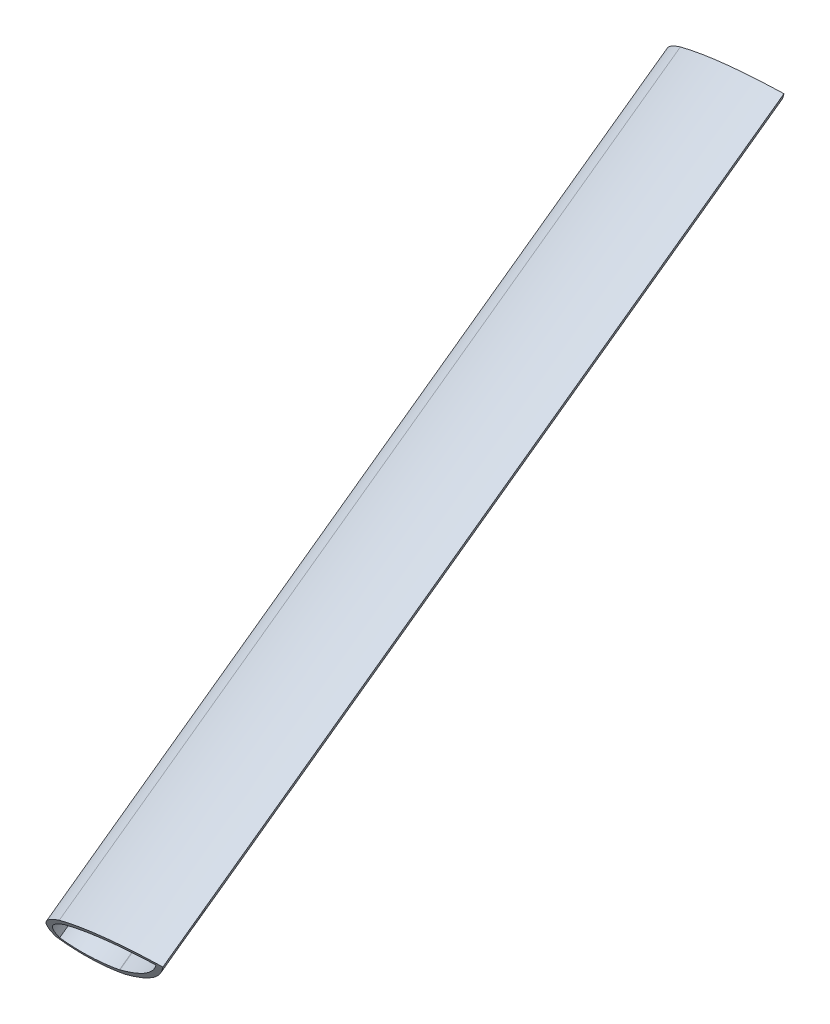
ISO-10303-21;
HEADER;
FILE_DESCRIPTION(('STEP AP214'),'2;1');
FILE_NAME('part.step','',(''),(''),'','','');
FILE_SCHEMA(('AUTOMOTIVE_DESIGN { 1 0 10303 214 1 1 1 1 }'));
ENDSEC;
DATA;
#1=APPLICATION_CONTEXT('core data for automotive mechanical design processes');
#2=APPLICATION_PROTOCOL_DEFINITION('international standard','automotive_design',2000,#1);
#3=PRODUCT_CONTEXT('',#1,'mechanical');
#4=PRODUCT('Part','Part','',(#3));
#5=PRODUCT_RELATED_PRODUCT_CATEGORY('part','',(#4));
#6=PRODUCT_DEFINITION_FORMATION('','',#4);
#7=PRODUCT_DEFINITION_CONTEXT('part definition',#1,'design');
#8=PRODUCT_DEFINITION('design','',#6,#7);
#9=PRODUCT_DEFINITION_SHAPE('','',#8);
#10=(LENGTH_UNIT() NAMED_UNIT(*) SI_UNIT(.MILLI.,.METRE.));
#11=(NAMED_UNIT(*) PLANE_ANGLE_UNIT() SI_UNIT($,.RADIAN.));
#12=(NAMED_UNIT(*) SI_UNIT($,.STERADIAN.) SOLID_ANGLE_UNIT());
#13=UNCERTAINTY_MEASURE_WITH_UNIT(LENGTH_MEASURE(1.E-05),#10,'distance_accuracy_value','');
#14=(GEOMETRIC_REPRESENTATION_CONTEXT(3) GLOBAL_UNCERTAINTY_ASSIGNED_CONTEXT((#13)) GLOBAL_UNIT_ASSIGNED_CONTEXT((#10,
#11,#12)) REPRESENTATION_CONTEXT('',''));
#15=CARTESIAN_POINT('',(0.,0.,0.));
#16=DIRECTION('',(0.,0.,1.));
#17=DIRECTION('',(1.,0.,0.));
#18=AXIS2_PLACEMENT_3D('',#15,#16,#17);
#19=CARTESIAN_POINT('',(-781.107520332874,334.657765301995,434.052857789617));
#20=DIRECTION('',(-0.0147326927785277,0.5661762234603,-0.824152553688773));
#21=DIRECTION('',(0.,0.824242010329109,0.566237678372455));
#22=AXIS2_PLACEMENT_3D('',#19,#20,#21);
#23=PLANE('',#22);
#24=DIRECTION('',(0.859046075895402,0.428966173917692,0.279334675833717));
#25=VECTOR('',#24,1.);
#26=CARTESIAN_POINT('',(-792.760380509847,326.928017950732,428.950985404653));
#27=LINE('',#26,#25);
#28=CARTESIAN_POINT('',(-792.796593426126,326.909934967085,428.939210107014));
#29=VERTEX_POINT('',#28);
#30=CARTESIAN_POINT('',(-792.611878379782,327.002172751435,428.999273611219));
#31=VERTEX_POINT('',#30);
#32=EDGE_CURVE('E304',#29,#31,#27,.T.);
#33=ORIENTED_EDGE('',*,*,#32,.T.);
#34=CARTESIAN_POINT('',(-792.611878379782,327.002172751435,428.999273611219));
#35=CARTESIAN_POINT('',(-790.503535609516,328.067935974323,429.693742405582));
#36=CARTESIAN_POINT('',(-788.481905018776,329.239479765861,430.462430404267));
#37=CARTESIAN_POINT('',(-785.59391722943,331.159438861091,431.729777509135));
#38=CARTESIAN_POINT('',(-784.658455705619,331.824324126815,432.169817838953));
#39=CARTESIAN_POINT('',(-782.841938872382,333.203896184277,433.085083719861));
#40=CARTESIAN_POINT('',(-781.959835350437,333.919509037805,433.560926718742));
#41=CARTESIAN_POINT('',(-779.402890297746,336.134277830375,435.036719931367));
#42=CARTESIAN_POINT('',(-777.820192779682,337.698664166072,436.083129297477));
#43=CARTESIAN_POINT('',(-775.625962113709,340.164138553547,437.73763615467));
#44=CARTESIAN_POINT('',(-774.926685937,341.00325719475,438.301593397965));
#45=CARTESIAN_POINT('',(-773.923763044823,342.286686714735,439.165355235097));
#46=CARTESIAN_POINT('',(-773.599626393743,342.719970355112,439.457218056392));
#47=CARTESIAN_POINT('',(-772.951459932842,343.586595135511,440.040985109994));
#48=CARTESIAN_POINT('',(-772.627376702391,344.01990752571,440.332868636795));
#49=CARTESIAN_POINT('',(-772.30329347194,344.453219915909,440.624752163596));
#50=B_SPLINE_CURVE_WITH_KNOTS('',3,(#34,#35,#36,#37,#38,#39,#40,#41,#42,#43,#44,#45,#46,#47,#48,
#49),.UNSPECIFIED.,.F.,.F.,(4,2,2,2,2,2,2,4),(0.,0.25000000000001,0.375000000000016,
0.500000000000021,0.750000000000023,0.875000000000016,0.937500000000008,1.),.UNSPECIFIED.);
#51=CARTESIAN_POINT('',(-772.30329347194,344.45321991591,440.624752163596));
#52=VERTEX_POINT('',#51);
#53=EDGE_CURVE('E336',#31,#52,#50,.T.);
#54=ORIENTED_EDGE('',*,*,#53,.T.);
#55=CARTESIAN_POINT('',(-800.427804121367,337.719246172713,436.501406270107));
#56=CARTESIAN_POINT('',(-798.304142877236,338.766730998508,437.183044337733));
#57=CARTESIAN_POINT('',(-796.108822244321,339.702450323204,437.786620759129));
#58=CARTESIAN_POINT('',(-792.709089325896,340.92293817373,438.564297147445));
#59=CARTESIAN_POINT('',(-791.561963398083,341.298161137011,438.801561553844));
#60=CARTESIAN_POINT('',(-789.239944105029,341.985384873826,439.232161618751));
#61=CARTESIAN_POINT('',(-788.063558818775,342.297724113374,439.425703126765));
#62=CARTESIAN_POINT('',(-784.503741280272,343.137349510131,439.938872971622));
#63=CARTESIAN_POINT('',(-782.093652371408,343.566510841312,440.190615008156));
#64=CARTESIAN_POINT('',(-778.435686076648,344.022646747793,440.438580764479));
#65=CARTESIAN_POINT('',(-777.212925884674,344.143017590887,440.499414840505));
#66=CARTESIAN_POINT('',(-775.373864976113,344.278241177467,440.559435354892));
#67=CARTESIAN_POINT('',(-774.759756507807,344.313290659061,440.572535735008));
#68=CARTESIAN_POINT('',(-773.531524989874,344.383255287485,440.598643949302));
#69=CARTESIAN_POINT('',(-772.917409230907,344.418237601697,440.611698056449));
#70=CARTESIAN_POINT('',(-772.30329347194,344.453219915909,440.624752163596));
#71=B_SPLINE_CURVE_WITH_KNOTS('',3,(#55,#56,#57,#58,#59,#60,#61,#62,#63,#64,#65,#66,#67,#68,#69,
#70),.UNSPECIFIED.,.F.,.F.,(4,2,2,2,2,2,2,4),(0.,0.250000000000015,0.375000000000015,
0.500000000000016,0.750000000000002,0.874999999999995,0.937499999999998,1.),.UNSPECIFIED.);
#72=CARTESIAN_POINT('',(-800.427804121367,337.719246172713,436.501406270107));
#73=VERTEX_POINT('',#72);
#74=EDGE_CURVE('E322',#73,#52,#71,.T.);
#75=ORIENTED_EDGE('',*,*,#74,.F.);
#76=CARTESIAN_POINT('',(-800.427804121367,337.719246172713,436.501406270107));
#77=CARTESIAN_POINT('',(-801.018629788744,337.397762318661,436.291115031462));
#78=CARTESIAN_POINT('',(-801.587069863766,337.053349134961,436.064671635961));
#79=CARTESIAN_POINT('',(-802.687987108001,336.327686336815,435.585836079048));
#80=CARTESIAN_POINT('',(-803.220864056987,335.946846212636,435.333732375745));
#81=CARTESIAN_POINT('',(-804.2533155772,335.151054684773,434.805495887364));
#82=CARTESIAN_POINT('',(-804.751573980345,334.737481325836,434.530286263255));
#83=CARTESIAN_POINT('',(-805.692284079329,333.880411667631,433.958312946746));
#84=CARTESIAN_POINT('',(-806.13596727307,333.435688767259,433.660728618533));
#85=CARTESIAN_POINT('',(-806.95342654856,332.503813923641,433.035162391716));
#86=CARTESIAN_POINT('',(-807.327371486566,332.016764465094,432.707253916542));
#87=CARTESIAN_POINT('',(-807.817606139182,331.243290470213,432.184656362349));
#88=CARTESIAN_POINT('',(-807.969929572516,330.976667045183,432.004214393374));
#89=CARTESIAN_POINT('',(-808.242492080457,330.434488574104,431.636621065963));
#90=CARTESIAN_POINT('',(-808.362285545601,330.160209671094,431.450338426329));
#91=CARTESIAN_POINT('',(-808.668942495774,329.327173276709,430.883541035419));
#92=CARTESIAN_POINT('',(-808.803297179031,328.758257624124,430.495109175391));
#93=CARTESIAN_POINT('',(-808.883829754309,327.881476033196,429.894217476343));
#94=CARTESIAN_POINT('',(-808.890091895998,327.586512964427,429.691695725511));
#95=CARTESIAN_POINT('',(-808.861147905313,327.001315792742,429.289159634247));
#96=CARTESIAN_POINT('',(-808.822122927993,326.709808966247,429.088202691994));
#97=CARTESIAN_POINT('',(-808.78905551815,326.418037233844,428.887170263213));
#98=B_SPLINE_CURVE_WITH_KNOTS('',3,(#76,#77,#78,#79,#80,#81,#82,#83,#84,#85,#86,#87,#88,#89,#90,
#91,#92,#93,#94,#95,#96,#97),.UNSPECIFIED.,.F.,.F.,(4,2,2,2,2,2,2,2,2,2,4),(0.,
0.124999999999991,0.249999999999981,0.374999999999972,0.499999999999962,0.624999999999953,
0.687499999999952,0.749999999999951,0.874999999999975,0.937499999999987,1.),.UNSPECIFIED.);
#99=CARTESIAN_POINT('',(-808.78905551815,326.418037233844,428.887170263213));
#100=VERTEX_POINT('',#99);
#101=EDGE_CURVE('E260',#73,#100,#98,.T.);
#102=ORIENTED_EDGE('',*,*,#101,.T.);
#103=CARTESIAN_POINT('',(-792.796593426126,326.909934967085,428.939210107014));
#104=CARTESIAN_POINT('',(-793.425045423054,326.640984541955,428.765680891869));
#105=CARTESIAN_POINT('',(-794.066302736607,326.398818081671,428.610780631755));
#106=CARTESIAN_POINT('',(-795.370285669853,325.959388881468,428.332211835144));
#107=CARTESIAN_POINT('',(-796.032601027481,325.761268025738,428.207946456433));
#108=CARTESIAN_POINT('',(-797.376763654905,325.405879817874,427.987830389881));
#109=CARTESIAN_POINT('',(-798.056475393877,325.248893328301,427.892134473853));
#110=CARTESIAN_POINT('',(-799.419962650095,324.989919108456,427.738598327728));
#111=CARTESIAN_POINT('',(-800.105625724563,324.887654150516,427.680601390099));
#112=CARTESIAN_POINT('',(-801.4872274321,324.754492175973,427.613819542358));
#113=CARTESIAN_POINT('',(-802.183141184108,324.723422350268,427.604915471091));
#114=CARTESIAN_POINT('',(-803.23740441286,324.748998458409,427.641331933602));
#115=CARTESIAN_POINT('',(-803.592621706374,324.7698618883,427.662014615617));
#116=CARTESIAN_POINT('',(-804.296784577416,324.839191823425,427.722230622792));
#117=CARTESIAN_POINT('',(-804.644113414739,324.887349652695,427.761522992651));
#118=CARTESIAN_POINT('',(-805.670901082643,325.074973411667,427.908771773235));
#119=CARTESIAN_POINT('',(-806.335223076776,325.257413569852,428.045980025649));
#120=CARTESIAN_POINT('',(-807.296818636635,325.63012095285,428.319212146953));
#121=CARTESIAN_POINT('',(-807.61007203493,325.7705768458,428.421302291229));
#122=CARTESIAN_POINT('',(-808.211196596432,326.079160776278,428.644039049179));
#123=CARTESIAN_POINT('',(-808.498522903462,326.250686357106,428.767009966802));
#124=CARTESIAN_POINT('',(-808.78905551815,326.418037233844,428.887170263213));
#125=B_SPLINE_CURVE_WITH_KNOTS('',3,(#103,#104,#105,#106,#107,#108,#109,#110,#111,#112,#113,
#114,#115,#116,#117,#118,#119,#120,#121,#122,#123,#124),.UNSPECIFIED.,.F.,.F.,(4,2,2,2,2,2,2,2,
2,2,4),(0.,0.125000000000006,0.250000000000013,0.375000000000019,0.500000000000025,
0.625000000000032,0.687500000000025,0.750000000000018,0.875000000000005,0.937500000000002,1.),.UNSPECIFIED.);
#126=EDGE_CURVE('E252',#29,#100,#125,.T.);
#127=ORIENTED_EDGE('',*,*,#126,.F.);
#128=EDGE_LOOP('',(#33,#54,#75,#102,#127));
#129=FACE_BOUND('',#128,.T.);
#130=DIRECTION('',(0.859046075895409,0.428966173917411,0.279334675834127));
#131=VECTOR('',#130,1.);
#132=CARTESIAN_POINT('',(-793.410222008644,327.821932425567,429.576703342803));
#133=LINE('',#132,#131);
#134=CARTESIAN_POINT('',(-793.410222008644,327.821932425567,429.576703342803));
#135=VERTEX_POINT('',#134);
#136=CARTESIAN_POINT('',(-793.261719878579,327.89608722627,429.624991549369));
#137=VERTEX_POINT('',#136);
#138=EDGE_CURVE('E189',#135,#137,#133,.T.);
#139=ORIENTED_EDGE('',*,*,#138,.F.);
#140=CARTESIAN_POINT('',(-793.410222008644,327.821932425567,429.576703342803));
#141=CARTESIAN_POINT('',(-794.68692202602,327.275559728663,429.224178801432));
#142=CARTESIAN_POINT('',(-799.829869031873,325.612926645429,428.173919528464));
#143=CARTESIAN_POINT('',(-804.812953252484,325.410870091522,428.12418921152));
#144=CARTESIAN_POINT('',(-807.578887011925,327.004086881108,429.268141399964));
#145=B_SPLINE_CURVE_WITH_KNOTS('',3,(#140,#141,#142,#143,#144),.UNSPECIFIED.,.F.,.F.,(4,1,4),
(0.,0.294150135644974,1.),.UNSPECIFIED.);
#146=CARTESIAN_POINT('',(-807.578887011925,327.004086881107,429.268141399964));
#147=VERTEX_POINT('',#146);
#148=EDGE_CURVE('E370',#135,#147,#145,.T.);
#149=ORIENTED_EDGE('',*,*,#148,.T.);
#150=CARTESIAN_POINT('',(-799.759532830395,336.834403820628,435.881591243632));
#151=CARTESIAN_POINT('',(-800.960700162994,336.180816942523,435.454062481531));
#152=CARTESIAN_POINT('',(-805.233822764462,333.28351953377,433.540064526205));
#153=CARTESIAN_POINT('',(-807.893964040924,329.784182782966,431.183643723624));
#154=CARTESIAN_POINT('',(-807.578887011925,327.004086881107,429.268141399964));
#155=B_SPLINE_CURVE_WITH_KNOTS('',3,(#150,#151,#152,#153,#154),.UNSPECIFIED.,.F.,.F.,(4,1,4),
(0.,0.294150135644974,1.),.UNSPECIFIED.);
#156=CARTESIAN_POINT('',(-799.759532830395,336.834403820628,435.881591243632));
#157=VERTEX_POINT('',#156);
#158=EDGE_CURVE('E217',#157,#147,#155,.T.);
#159=ORIENTED_EDGE('',*,*,#158,.F.);
#160=CARTESIAN_POINT('',(-799.759532830395,336.834403820628,435.881591243632));
#161=CARTESIAN_POINT('',(-788.284819564579,342.49424625525,439.564665179595));
#162=CARTESIAN_POINT('',(-774.67362554331,343.269590413256,439.853994972157));
#163=B_SPLINE_CURVE_WITH_KNOTS('',2,(#160,#161,#162),.UNSPECIFIED.,.F.,.F.,(3,3),(0.,1.),.UNSPECIFIED.);
#164=CARTESIAN_POINT('',(-774.67362554331,343.269590413256,439.853994972157));
#165=VERTEX_POINT('',#164);
#166=EDGE_CURVE('E213',#157,#165,#163,.T.);
#167=ORIENTED_EDGE('',*,*,#166,.T.);
#168=CARTESIAN_POINT('',(-793.261719878579,327.89608722627,429.624991549369));
#169=CARTESIAN_POINT('',(-781.861756604429,333.658754887763,433.380040591182));
#170=CARTESIAN_POINT('',(-774.67362554331,343.269590413256,439.853994972157));
#171=B_SPLINE_CURVE_WITH_KNOTS('',2,(#168,#169,#170),.UNSPECIFIED.,.F.,.F.,(3,3),(0.,1.),.UNSPECIFIED.);
#172=EDGE_CURVE('E198',#137,#165,#171,.T.);
#173=ORIENTED_EDGE('',*,*,#172,.F.);
#174=EDGE_LOOP('',(#139,#149,#159,#167,#173));
#175=FACE_BOUND('',#174,.T.);
#176=ADVANCED_FACE('F111',(#129,#175),#23,.F.);
#177=CARTESIAN_POINT('',(-783.726993108882,435.323897833222,287.518533743743));
#178=DIRECTION('',(-0.0147326927785277,0.5661762234603,-0.824152553688773));
#179=DIRECTION('',(0.,0.824242010329109,0.566237678372455));
#180=AXIS2_PLACEMENT_3D('',#177,#178,#179);
#181=PLANE('',#180);
#182=DIRECTION('',(0.859046075895402,0.428966173917692,0.279334675833717));
#183=VECTOR('',#182,1.);
#184=CARTESIAN_POINT('',(-795.379853285855,427.59415048196,282.41666135878));
#185=LINE('',#184,#183);
#186=CARTESIAN_POINT('',(-795.416066202135,427.576067498312,282.40488606114));
#187=VERTEX_POINT('',#186);
#188=CARTESIAN_POINT('',(-795.23135115579,427.668305282663,282.464949565346));
#189=VERTEX_POINT('',#188);
#190=EDGE_CURVE('E207',#187,#189,#185,.T.);
#191=ORIENTED_EDGE('',*,*,#190,.F.);
#192=CARTESIAN_POINT('',(-795.416066202135,427.576067498312,282.40488606114));
#193=CARTESIAN_POINT('',(-796.044518199063,427.307117073183,282.231356845995));
#194=CARTESIAN_POINT('',(-796.685775512616,427.064950612898,282.076456585881));
#195=CARTESIAN_POINT('',(-797.989758445861,426.625521412696,281.79788778927));
#196=CARTESIAN_POINT('',(-798.65207380349,426.427400556965,281.673622410559));
#197=CARTESIAN_POINT('',(-799.996236430913,426.072012349101,281.453506344007));
#198=CARTESIAN_POINT('',(-800.675948169885,425.915025859529,281.357810427979));
#199=CARTESIAN_POINT('',(-802.039435426103,425.656051639684,281.204274281854));
#200=CARTESIAN_POINT('',(-802.725098500572,425.553786681744,281.146277344225));
#201=CARTESIAN_POINT('',(-804.106700208109,425.420624707201,281.079495496484));
#202=CARTESIAN_POINT('',(-804.802613960117,425.389554881496,281.070591425218));
#203=CARTESIAN_POINT('',(-805.856877188869,425.415130989636,281.107007887728));
#204=CARTESIAN_POINT('',(-806.212094482382,425.435994419528,281.127690569743));
#205=CARTESIAN_POINT('',(-806.916257353425,425.505324354653,281.187906576919));
#206=CARTESIAN_POINT('',(-807.263586190747,425.553482183922,281.227198946777));
#207=CARTESIAN_POINT('',(-808.290373858651,425.741105942895,281.374447727362));
#208=CARTESIAN_POINT('',(-808.954695852784,425.92354610108,281.511655979776));
#209=CARTESIAN_POINT('',(-809.916291412643,426.296253484078,281.784888101079));
#210=CARTESIAN_POINT('',(-810.229544810939,426.436709377027,281.886978245355));
#211=CARTESIAN_POINT('',(-810.830669372441,426.745293307505,282.109715003305));
#212=CARTESIAN_POINT('',(-811.11799567947,426.916818888334,282.232685920929));
#213=CARTESIAN_POINT('',(-811.408528294158,427.084169765072,282.352846217339));
#214=B_SPLINE_CURVE_WITH_KNOTS('',3,(#192,#193,#194,#195,#196,#197,#198,#199,#200,#201,#202,
#203,#204,#205,#206,#207,#208,#209,#210,#211,#212,#213),.UNSPECIFIED.,.F.,.F.,(4,2,2,2,2,2,2,2,
2,2,4),(0.,0.125000000000006,0.250000000000013,0.375000000000019,0.500000000000025,
0.625000000000032,0.687500000000025,0.750000000000018,0.875000000000005,0.937500000000002,1.),.UNSPECIFIED.);
#215=CARTESIAN_POINT('',(-811.408528294158,427.084169765072,282.352846217339));
#216=VERTEX_POINT('',#215);
#217=EDGE_CURVE('E295',#187,#216,#214,.T.);
#218=ORIENTED_EDGE('',*,*,#217,.T.);
#219=CARTESIAN_POINT('',(-803.047276897376,438.38537870394,289.967082224233));
#220=CARTESIAN_POINT('',(-803.638102564752,438.063894849889,289.756790985589));
#221=CARTESIAN_POINT('',(-804.206542639775,437.719481666189,289.530347590087));
#222=CARTESIAN_POINT('',(-805.307459884009,436.993818868042,289.051512033175));
#223=CARTESIAN_POINT('',(-805.840336832995,436.612978743863,288.799408329872));
#224=CARTESIAN_POINT('',(-806.872788353209,435.817187216,288.27117184149));
#225=CARTESIAN_POINT('',(-807.371046756353,435.403613857063,287.995962217382));
#226=CARTESIAN_POINT('',(-808.311756855337,434.546544198859,287.423988900873));
#227=CARTESIAN_POINT('',(-808.755440049078,434.101821298487,287.126404572659));
#228=CARTESIAN_POINT('',(-809.572899324568,433.169946454868,286.500838345842));
#229=CARTESIAN_POINT('',(-809.946844262574,432.682896996321,286.172929870668));
#230=CARTESIAN_POINT('',(-810.437078915191,431.90942300144,285.650332316475));
#231=CARTESIAN_POINT('',(-810.589402348524,431.64279957641,285.4698903475));
#232=CARTESIAN_POINT('',(-810.861964856465,431.100621105331,285.102297020089));
#233=CARTESIAN_POINT('',(-810.981758321609,430.826342202321,284.916014380456));
#234=CARTESIAN_POINT('',(-811.288415271782,429.993305807936,284.349216989546));
#235=CARTESIAN_POINT('',(-811.422769955039,429.424390155351,283.960785129518));
#236=CARTESIAN_POINT('',(-811.503302530317,428.547608564423,283.35989343047));
#237=CARTESIAN_POINT('',(-811.509564672007,428.252645495655,283.157371679637));
#238=CARTESIAN_POINT('',(-811.480620681322,427.66744832397,282.754835588374));
#239=CARTESIAN_POINT('',(-811.441595704002,427.375941497475,282.553878646121));
#240=CARTESIAN_POINT('',(-811.408528294158,427.084169765072,282.352846217339));
#241=B_SPLINE_CURVE_WITH_KNOTS('',3,(#219,#220,#221,#222,#223,#224,#225,#226,#227,#228,#229,
#230,#231,#232,#233,#234,#235,#236,#237,#238,#239,#240),.UNSPECIFIED.,.F.,.F.,(4,2,2,2,2,2,2,2,
2,2,4),(0.,0.124999999999991,0.249999999999981,0.374999999999972,0.499999999999962,
0.624999999999953,0.687499999999952,0.749999999999951,0.874999999999975,0.937499999999987,1.),.UNSPECIFIED.);
#242=CARTESIAN_POINT('',(-803.047276897376,438.38537870394,289.967082224233));
#243=VERTEX_POINT('',#242);
#244=EDGE_CURVE('E286',#243,#216,#241,.T.);
#245=ORIENTED_EDGE('',*,*,#244,.F.);
#246=CARTESIAN_POINT('',(-803.047276897376,438.38537870394,289.967082224233));
#247=CARTESIAN_POINT('',(-800.923615653245,439.432863529735,290.648720291859));
#248=CARTESIAN_POINT('',(-798.728295020329,440.368582854431,291.252296713255));
#249=CARTESIAN_POINT('',(-795.328562101904,441.589070704958,292.029973101571));
#250=CARTESIAN_POINT('',(-794.181436174091,441.964293668238,292.26723750797));
#251=CARTESIAN_POINT('',(-791.859416881038,442.651517405053,292.697837572878));
#252=CARTESIAN_POINT('',(-790.683031594783,442.963856644601,292.891379080891));
#253=CARTESIAN_POINT('',(-787.12321405628,443.803482041358,293.404548925748));
#254=CARTESIAN_POINT('',(-784.713125147416,444.23264337254,293.656290962283));
#255=CARTESIAN_POINT('',(-781.055158852656,444.68877927902,293.904256718606));
#256=CARTESIAN_POINT('',(-779.832398660682,444.809150122114,293.965090794631));
#257=CARTESIAN_POINT('',(-777.993337752121,444.944373708695,294.025111309019));
#258=CARTESIAN_POINT('',(-777.379229283816,444.979423190288,294.038211689135));
#259=CARTESIAN_POINT('',(-776.150997765882,445.049387818713,294.064319903428));
#260=CARTESIAN_POINT('',(-775.536882006915,445.084370132925,294.077374010575));
#261=CARTESIAN_POINT('',(-774.922766247948,445.119352447137,294.090428117722));
#262=B_SPLINE_CURVE_WITH_KNOTS('',3,(#246,#247,#248,#249,#250,#251,#252,#253,#254,#255,#256,
#257,#258,#259,#260,#261),.UNSPECIFIED.,.F.,.F.,(4,2,2,2,2,2,2,4),(0.,0.250000000000015,
0.375000000000015,0.500000000000016,0.750000000000002,0.874999999999995,0.937499999999998,1.),.UNSPECIFIED.);
#263=CARTESIAN_POINT('',(-774.922766247949,445.119352447137,294.090428117722));
#264=VERTEX_POINT('',#263);
#265=EDGE_CURVE('E277',#243,#264,#262,.T.);
#266=ORIENTED_EDGE('',*,*,#265,.T.);
#267=CARTESIAN_POINT('',(-795.23135115579,427.668305282663,282.464949565346));
#268=CARTESIAN_POINT('',(-793.123008385524,428.734068505551,283.159418359709));
#269=CARTESIAN_POINT('',(-791.101377794784,429.905612297088,283.928106358393));
#270=CARTESIAN_POINT('',(-788.213390005438,431.825571392318,285.195453463261));
#271=CARTESIAN_POINT('',(-787.277928481627,432.490456658042,285.635493793079));
#272=CARTESIAN_POINT('',(-785.461411648391,433.870028715504,286.550759673987));
#273=CARTESIAN_POINT('',(-784.579308126446,434.585641569033,287.026602672868));
#274=CARTESIAN_POINT('',(-782.022363073754,436.800410361603,288.502395885494));
#275=CARTESIAN_POINT('',(-780.43966555569,438.3647966973,289.548805251603));
#276=CARTESIAN_POINT('',(-778.245434889717,440.830271084774,291.203312108796));
#277=CARTESIAN_POINT('',(-777.546158713008,441.669389725977,291.767269352091));
#278=CARTESIAN_POINT('',(-776.543235820831,442.952819245962,292.631031189223));
#279=CARTESIAN_POINT('',(-776.219099169751,443.38610288634,292.922894010519));
#280=CARTESIAN_POINT('',(-775.57093270885,444.252727666738,293.50666106412));
#281=CARTESIAN_POINT('',(-775.2468494784,444.686040056938,293.798544590921));
#282=CARTESIAN_POINT('',(-774.922766247949,445.119352447137,294.090428117722));
#283=B_SPLINE_CURVE_WITH_KNOTS('',3,(#267,#268,#269,#270,#271,#272,#273,#274,#275,#276,#277,
#278,#279,#280,#281,#282),.UNSPECIFIED.,.F.,.F.,(4,2,2,2,2,2,2,4),(0.,0.25000000000001,
0.375000000000016,0.500000000000021,0.750000000000023,0.875000000000016,0.937500000000008,1.),.UNSPECIFIED.);
#284=EDGE_CURVE('E271',#189,#264,#283,.T.);
#285=ORIENTED_EDGE('',*,*,#284,.F.);
#286=EDGE_LOOP('',(#191,#218,#245,#266,#285));
#287=FACE_BOUND('',#286,.T.);
#288=CARTESIAN_POINT('',(-796.029694784653,428.488064956795,283.042379296929));
#289=CARTESIAN_POINT('',(-797.306394802028,427.94169225989,282.689854755558));
#290=CARTESIAN_POINT('',(-802.449341807882,426.279059176656,281.63959548259));
#291=CARTESIAN_POINT('',(-807.432426028492,426.077002622749,281.589865165646));
#292=CARTESIAN_POINT('',(-810.198359787934,427.670219412335,282.73381735409));
#293=B_SPLINE_CURVE_WITH_KNOTS('',3,(#288,#289,#290,#291,#292),.UNSPECIFIED.,.F.,.F.,(4,1,4),
(0.,0.294150135644974,1.),.UNSPECIFIED.);
#294=CARTESIAN_POINT('',(-796.029694784653,428.488064956794,283.042379296929));
#295=VERTEX_POINT('',#294);
#296=CARTESIAN_POINT('',(-810.198359787934,427.670219412335,282.73381735409));
#297=VERTEX_POINT('',#296);
#298=EDGE_CURVE('E199',#295,#297,#293,.T.);
#299=ORIENTED_EDGE('',*,*,#298,.F.);
#300=DIRECTION('',(0.859046075895409,0.428966173917411,0.279334675834127));
#301=VECTOR('',#300,1.);
#302=CARTESIAN_POINT('',(-796.029694784653,428.488064956795,283.042379296929));
#303=LINE('',#302,#301);
#304=CARTESIAN_POINT('',(-795.881192654587,428.562219757497,283.090667503495));
#305=VERTEX_POINT('',#304);
#306=EDGE_CURVE('E135',#295,#305,#303,.T.);
#307=ORIENTED_EDGE('',*,*,#306,.T.);
#308=CARTESIAN_POINT('',(-795.881192654587,428.562219757497,283.090667503495));
#309=CARTESIAN_POINT('',(-784.481229380437,434.324887418991,286.845716545308));
#310=CARTESIAN_POINT('',(-777.293098319318,443.935722944483,293.319670926284));
#311=B_SPLINE_CURVE_WITH_KNOTS('',2,(#308,#309,#310),.UNSPECIFIED.,.F.,.F.,(3,3),(0.,1.),.UNSPECIFIED.);
#312=CARTESIAN_POINT('',(-777.293098319318,443.935722944483,293.319670926284));
#313=VERTEX_POINT('',#312);
#314=EDGE_CURVE('E205',#305,#313,#311,.T.);
#315=ORIENTED_EDGE('',*,*,#314,.T.);
#316=CARTESIAN_POINT('',(-802.379005606403,437.500536351855,289.347267197759));
#317=CARTESIAN_POINT('',(-790.904292340587,443.160378786478,293.030341133722));
#318=CARTESIAN_POINT('',(-777.293098319318,443.935722944483,293.319670926284));
#319=B_SPLINE_CURVE_WITH_KNOTS('',2,(#316,#317,#318),.UNSPECIFIED.,.F.,.F.,(3,3),(0.,1.),.UNSPECIFIED.);
#320=CARTESIAN_POINT('',(-802.379005606403,437.500536351855,289.347267197759));
#321=VERTEX_POINT('',#320);
#322=EDGE_CURVE('E384',#321,#313,#319,.T.);
#323=ORIENTED_EDGE('',*,*,#322,.F.);
#324=CARTESIAN_POINT('',(-802.379005606403,437.500536351855,289.347267197759));
#325=CARTESIAN_POINT('',(-803.580172939002,436.846949473751,288.919738435657));
#326=CARTESIAN_POINT('',(-807.85329554047,433.949652064997,287.005740480331));
#327=CARTESIAN_POINT('',(-810.513436816932,430.450315314194,284.649319677751));
#328=CARTESIAN_POINT('',(-810.198359787934,427.670219412335,282.73381735409));
#329=B_SPLINE_CURVE_WITH_KNOTS('',3,(#324,#325,#326,#327,#328),.UNSPECIFIED.,.F.,.F.,(4,1,4),
(0.,0.294150135644974,1.),.UNSPECIFIED.);
#330=EDGE_CURVE('E375',#321,#297,#329,.T.);
#331=ORIENTED_EDGE('',*,*,#330,.T.);
#332=EDGE_LOOP('',(#299,#307,#315,#323,#331));
#333=FACE_BOUND('',#332,.T.);
#334=ADVANCED_FACE('F240',(#287,#333),#181,.T.);
#335=CARTESIAN_POINT('',(-792.760380509847,326.928017950732,428.950985404653));
#336=DIRECTION('',(-0.511686219525411,0.703869665224137,0.492691289881458));
#337=DIRECTION('',(-0.808855773889066,-0.588007089282365,0.));
#338=AXIS2_PLACEMENT_3D('',#335,#336,#337);
#339=PLANE('',#338);
#340=ORIENTED_EDGE('',*,*,#190,.T.);
#341=DIRECTION('',(-0.0147326927784492,0.566176223460222,-0.824152553688828));
#342=VECTOR('',#341,1.);
#343=CARTESIAN_POINT('',(-792.611878379782,327.002172751435,428.999273611219));
#344=LINE('',#343,#342);
#345=EDGE_CURVE('E12',#31,#189,#344,.T.);
#346=ORIENTED_EDGE('',*,*,#345,.F.);
#347=ORIENTED_EDGE('',*,*,#32,.F.);
#348=DIRECTION('',(-0.0147326927784492,0.566176223460222,-0.824152553688828));
#349=VECTOR('',#348,1.);
#350=CARTESIAN_POINT('',(-792.796593426126,326.909934967085,428.939210107014));
#351=LINE('',#350,#349);
#352=EDGE_CURVE('E259',#29,#187,#351,.T.);
#353=ORIENTED_EDGE('',*,*,#352,.T.);
#354=EDGE_LOOP('',(#340,#346,#347,#353));
#355=FACE_BOUND('',#354,.T.);
#356=ADVANCED_FACE('F113',(#355),#339,.F.);
#357=DIRECTION('',(-0.0147326927784492,0.566176223460222,-0.824152553688828));
#358=VECTOR('',#357,1.);
#359=SURFACE_OF_LINEAR_EXTRUSION('',#50,#358);
#360=ORIENTED_EDGE('',*,*,#284,.T.);
#361=DIRECTION('',(-0.0147326927784492,0.566176223460222,-0.824152553688828));
#362=VECTOR('',#361,1.);
#363=CARTESIAN_POINT('',(-772.30329347194,344.45321991591,440.624752163596));
#364=LINE('',#363,#362);
#365=EDGE_CURVE('E120',#52,#264,#364,.T.);
#366=ORIENTED_EDGE('',*,*,#365,.F.);
#367=ORIENTED_EDGE('',*,*,#53,.F.);
#368=ORIENTED_EDGE('',*,*,#345,.T.);
#369=EDGE_LOOP('',(#360,#366,#367,#368));
#370=FACE_BOUND('',#369,.T.);
#371=ADVANCED_FACE('F324',(#370),#359,.F.);
#372=DIRECTION('',(-0.0147326927784492,0.566176223460222,-0.824152553688828));
#373=VECTOR('',#372,1.);
#374=SURFACE_OF_LINEAR_EXTRUSION('',#71,#373);
#375=ORIENTED_EDGE('',*,*,#265,.F.);
#376=DIRECTION('',(-0.0147326927784492,0.566176223460222,-0.824152553688828));
#377=VECTOR('',#376,1.);
#378=CARTESIAN_POINT('',(-800.427804121367,337.719246172713,436.501406270107));
#379=LINE('',#378,#377);
#380=EDGE_CURVE('E313',#73,#243,#379,.T.);
#381=ORIENTED_EDGE('',*,*,#380,.F.);
#382=ORIENTED_EDGE('',*,*,#74,.T.);
#383=ORIENTED_EDGE('',*,*,#365,.T.);
#384=EDGE_LOOP('',(#375,#381,#382,#383));
#385=FACE_BOUND('',#384,.T.);
#386=ADVANCED_FACE('F320',(#385),#374,.T.);
#387=DIRECTION('',(-0.0147326927784492,0.566176223460222,-0.824152553688828));
#388=VECTOR('',#387,1.);
#389=SURFACE_OF_LINEAR_EXTRUSION('',#98,#388);
#390=ORIENTED_EDGE('',*,*,#244,.T.);
#391=DIRECTION('',(-0.0147326927784492,0.566176223460222,-0.824152553688828));
#392=VECTOR('',#391,1.);
#393=CARTESIAN_POINT('',(-808.78905551815,326.418037233844,428.887170263213));
#394=LINE('',#393,#392);
#395=EDGE_CURVE('E310',#100,#216,#394,.T.);
#396=ORIENTED_EDGE('',*,*,#395,.F.);
#397=ORIENTED_EDGE('',*,*,#101,.F.);
#398=ORIENTED_EDGE('',*,*,#380,.T.);
#399=EDGE_LOOP('',(#390,#396,#397,#398));
#400=FACE_BOUND('',#399,.T.);
#401=ADVANCED_FACE('F248',(#400),#389,.F.);
#402=DIRECTION('',(-0.0147326927784492,0.566176223460222,-0.824152553688828));
#403=VECTOR('',#402,1.);
#404=SURFACE_OF_LINEAR_EXTRUSION('',#125,#403);
#405=ORIENTED_EDGE('',*,*,#217,.F.);
#406=ORIENTED_EDGE('',*,*,#352,.F.);
#407=ORIENTED_EDGE('',*,*,#126,.T.);
#408=ORIENTED_EDGE('',*,*,#395,.T.);
#409=EDGE_LOOP('',(#405,#406,#407,#408));
#410=FACE_BOUND('',#409,.T.);
#411=ADVANCED_FACE('F237',(#410),#404,.T.);
#412=CARTESIAN_POINT('',(-793.410222008644,327.821932425567,429.576703342803));
#413=DIRECTION('',(-0.511686219525411,0.703869665224137,0.492691289881458));
#414=DIRECTION('',(-0.808855773889067,-0.588007089282365,0.));
#415=AXIS2_PLACEMENT_3D('',#412,#413,#414);
#416=PLANE('',#415);
#417=ORIENTED_EDGE('',*,*,#306,.F.);
#418=DIRECTION('',(-0.0147326927784492,0.566176223460222,-0.824152553688828));
#419=VECTOR('',#418,1.);
#420=CARTESIAN_POINT('',(-793.410222008644,327.821932425567,429.576703342803));
#421=LINE('',#420,#419);
#422=EDGE_CURVE('E193',#135,#295,#421,.T.);
#423=ORIENTED_EDGE('',*,*,#422,.F.);
#424=ORIENTED_EDGE('',*,*,#138,.T.);
#425=DIRECTION('',(-0.0147326927784492,0.566176223460222,-0.824152553688828));
#426=VECTOR('',#425,1.);
#427=CARTESIAN_POINT('',(-793.261719878579,327.89608722627,429.624991549369));
#428=LINE('',#427,#426);
#429=EDGE_CURVE('E192',#137,#305,#428,.T.);
#430=ORIENTED_EDGE('',*,*,#429,.T.);
#431=EDGE_LOOP('',(#417,#423,#424,#430));
#432=FACE_BOUND('',#431,.T.);
#433=ADVANCED_FACE('F191',(#432),#416,.T.);
#434=DIRECTION('',(-0.0147326927784492,0.566176223460222,-0.824152553688828));
#435=VECTOR('',#434,1.);
#436=SURFACE_OF_LINEAR_EXTRUSION('',#171,#435);
#437=ORIENTED_EDGE('',*,*,#314,.F.);
#438=ORIENTED_EDGE('',*,*,#429,.F.);
#439=ORIENTED_EDGE('',*,*,#172,.T.);
#440=DIRECTION('',(-0.0147326927784492,0.566176223460222,-0.824152553688828));
#441=VECTOR('',#440,1.);
#442=CARTESIAN_POINT('',(-774.67362554331,343.269590413256,439.853994972157));
#443=LINE('',#442,#441);
#444=EDGE_CURVE('E208',#165,#313,#443,.T.);
#445=ORIENTED_EDGE('',*,*,#444,.T.);
#446=EDGE_LOOP('',(#437,#438,#439,#445));
#447=FACE_BOUND('',#446,.T.);
#448=ADVANCED_FACE('F202',(#447),#436,.T.);
#449=DIRECTION('',(-0.0147326927784492,0.566176223460222,-0.824152553688828));
#450=VECTOR('',#449,1.);
#451=SURFACE_OF_LINEAR_EXTRUSION('',#163,#450);
#452=ORIENTED_EDGE('',*,*,#322,.T.);
#453=ORIENTED_EDGE('',*,*,#444,.F.);
#454=ORIENTED_EDGE('',*,*,#166,.F.);
#455=DIRECTION('',(-0.0147326927784492,0.566176223460222,-0.824152553688828));
#456=VECTOR('',#455,1.);
#457=CARTESIAN_POINT('',(-799.759532830395,336.834403820628,435.881591243632));
#458=LINE('',#457,#456);
#459=EDGE_CURVE('E363',#157,#321,#458,.T.);
#460=ORIENTED_EDGE('',*,*,#459,.T.);
#461=EDGE_LOOP('',(#452,#453,#454,#460));
#462=FACE_BOUND('',#461,.T.);
#463=ADVANCED_FACE('F233',(#462),#451,.F.);
#464=DIRECTION('',(-0.0147326927784492,0.566176223460222,-0.824152553688828));
#465=VECTOR('',#464,1.);
#466=SURFACE_OF_LINEAR_EXTRUSION('',#155,#465);
#467=ORIENTED_EDGE('',*,*,#330,.F.);
#468=ORIENTED_EDGE('',*,*,#459,.F.);
#469=ORIENTED_EDGE('',*,*,#158,.T.);
#470=DIRECTION('',(-0.0147326927784492,0.566176223460222,-0.824152553688828));
#471=VECTOR('',#470,1.);
#472=CARTESIAN_POINT('',(-807.578887011925,327.004086881107,429.268141399964));
#473=LINE('',#472,#471);
#474=EDGE_CURVE('E127',#147,#297,#473,.T.);
#475=ORIENTED_EDGE('',*,*,#474,.T.);
#476=EDGE_LOOP('',(#467,#468,#469,#475));
#477=FACE_BOUND('',#476,.T.);
#478=ADVANCED_FACE('F418',(#477),#466,.T.);
#479=DIRECTION('',(-0.0147326927784492,0.566176223460222,-0.824152553688828));
#480=VECTOR('',#479,1.);
#481=SURFACE_OF_LINEAR_EXTRUSION('',#145,#480);
#482=ORIENTED_EDGE('',*,*,#298,.T.);
#483=ORIENTED_EDGE('',*,*,#474,.F.);
#484=ORIENTED_EDGE('',*,*,#148,.F.);
#485=ORIENTED_EDGE('',*,*,#422,.T.);
#486=EDGE_LOOP('',(#482,#483,#484,#485));
#487=FACE_BOUND('',#486,.T.);
#488=ADVANCED_FACE('F416',(#487),#481,.F.);
#489=CLOSED_SHELL('',(#176,#334,#356,#371,#386,#401,#411,#433,#448,#463,#478,#488));
#490=MANIFOLD_SOLID_BREP('B2',#489);
#491=ADVANCED_BREP_SHAPE_REPRESENTATION('',(#18,#490),#14);
#492=SHAPE_DEFINITION_REPRESENTATION(#9,#491);
ENDSEC;
END-ISO-10303-21;
